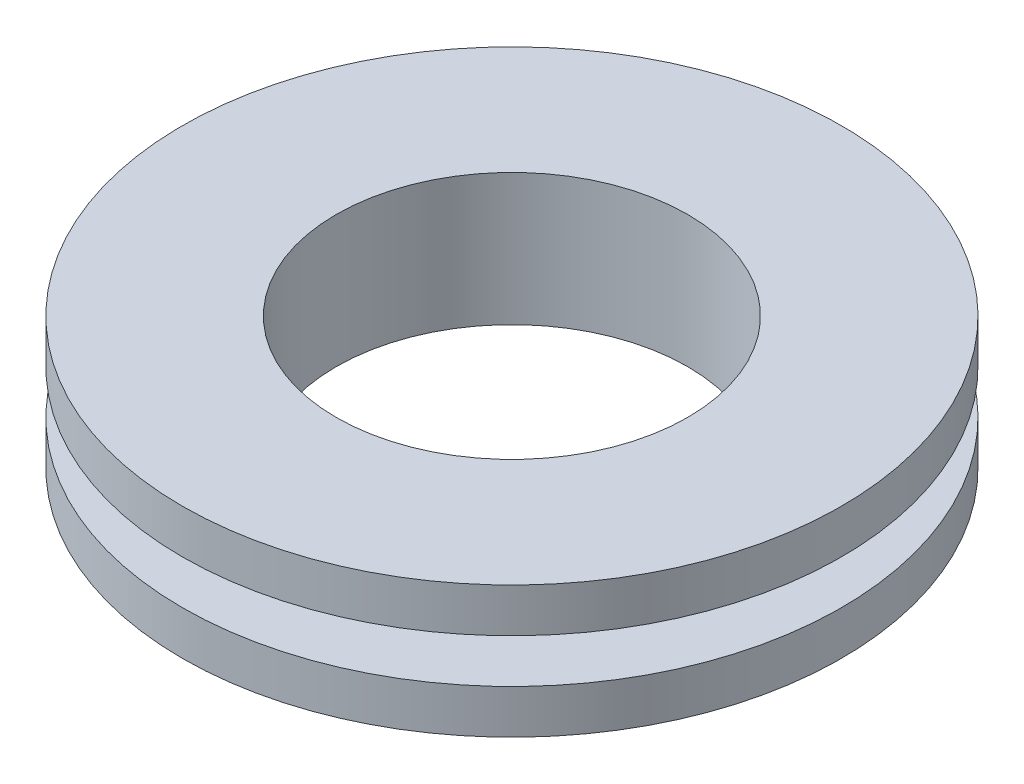
ISO-10303-21;
HEADER;
FILE_DESCRIPTION(('STEP AP214'),'2;1');
FILE_NAME('part.step','',(''),(''),'','','');
FILE_SCHEMA(('AUTOMOTIVE_DESIGN { 1 0 10303 214 1 1 1 1 }'));
ENDSEC;
DATA;
#1=APPLICATION_CONTEXT('core data for automotive mechanical design processes');
#2=APPLICATION_PROTOCOL_DEFINITION('international standard','automotive_design',2000,#1);
#3=PRODUCT_CONTEXT('',#1,'mechanical');
#4=PRODUCT('Part','Part','',(#3));
#5=PRODUCT_RELATED_PRODUCT_CATEGORY('part','',(#4));
#6=PRODUCT_DEFINITION_FORMATION('','',#4);
#7=PRODUCT_DEFINITION_CONTEXT('part definition',#1,'design');
#8=PRODUCT_DEFINITION('design','',#6,#7);
#9=PRODUCT_DEFINITION_SHAPE('','',#8);
#10=(LENGTH_UNIT() NAMED_UNIT(*) SI_UNIT(.MILLI.,.METRE.));
#11=(NAMED_UNIT(*) PLANE_ANGLE_UNIT() SI_UNIT($,.RADIAN.));
#12=(NAMED_UNIT(*) SI_UNIT($,.STERADIAN.) SOLID_ANGLE_UNIT());
#13=UNCERTAINTY_MEASURE_WITH_UNIT(LENGTH_MEASURE(1.E-05),#10,'distance_accuracy_value','');
#14=(GEOMETRIC_REPRESENTATION_CONTEXT(3) GLOBAL_UNCERTAINTY_ASSIGNED_CONTEXT((#13)) GLOBAL_UNIT_ASSIGNED_CONTEXT((#10,
#11,#12)) REPRESENTATION_CONTEXT('',''));
#15=CARTESIAN_POINT('',(0.,0.,0.));
#16=DIRECTION('',(0.,0.,1.));
#17=DIRECTION('',(1.,0.,0.));
#18=AXIS2_PLACEMENT_3D('',#15,#16,#17);
#19=CARTESIAN_POINT('',(4.,1.5,0.));
#20=DIRECTION('',(0.,-1.,0.));
#21=DIRECTION('',(0.,0.,-1.));
#22=AXIS2_PLACEMENT_3D('',#19,#20,#21);
#23=PLANE('',#22);
#24=CARTESIAN_POINT('',(0.,1.5,0.));
#25=DIRECTION('',(0.,1.,0.));
#26=DIRECTION('',(0.,0.,1.));
#27=AXIS2_PLACEMENT_3D('',#24,#25,#26);
#28=CIRCLE('',#27,4.);
#29=CARTESIAN_POINT('',(0.,1.5,4.));
#30=VERTEX_POINT('',#29);
#31=EDGE_CURVE('E67',#30,#30,#28,.T.);
#32=ORIENTED_EDGE('',*,*,#31,.F.);
#33=EDGE_LOOP('',(#32));
#34=FACE_BOUND('',#33,.T.);
#35=CARTESIAN_POINT('',(0.,1.5,0.));
#36=DIRECTION('',(0.,1.,0.));
#37=DIRECTION('',(0.,0.,1.));
#38=AXIS2_PLACEMENT_3D('',#35,#36,#37);
#39=CIRCLE('',#38,7.5);
#40=CARTESIAN_POINT('',(0.,1.5,7.5));
#41=VERTEX_POINT('',#40);
#42=EDGE_CURVE('E10',#41,#41,#39,.T.);
#43=ORIENTED_EDGE('',*,*,#42,.T.);
#44=EDGE_LOOP('',(#43));
#45=FACE_BOUND('',#44,.T.);
#46=ADVANCED_FACE('F39',(#34,#45),#23,.F.);
#47=CARTESIAN_POINT('',(0.,5.87055879509432,0.));
#48=DIRECTION('',(0.,1.,0.));
#49=DIRECTION('',(0.,0.,1.));
#50=AXIS2_PLACEMENT_3D('',#47,#48,#49);
#51=CYLINDRICAL_SURFACE('',#50,7.5);
#52=ORIENTED_EDGE('',*,*,#42,.F.);
#53=EDGE_LOOP('',(#52));
#54=FACE_BOUND('',#53,.T.);
#55=CARTESIAN_POINT('',(0.,0.5,0.));
#56=DIRECTION('',(0.,1.,0.));
#57=DIRECTION('',(0.,0.,1.));
#58=AXIS2_PLACEMENT_3D('',#55,#56,#57);
#59=CIRCLE('',#58,7.5);
#60=CARTESIAN_POINT('',(0.,0.5,7.5));
#61=VERTEX_POINT('',#60);
#62=EDGE_CURVE('E45',#61,#61,#59,.T.);
#63=ORIENTED_EDGE('',*,*,#62,.T.);
#64=EDGE_LOOP('',(#63));
#65=FACE_BOUND('',#64,.T.);
#66=ADVANCED_FACE('F74',(#54,#65),#51,.T.);
#67=CARTESIAN_POINT('',(7.5,0.5,0.));
#68=DIRECTION('',(0.,1.,0.));
#69=DIRECTION('',(0.,0.,1.));
#70=AXIS2_PLACEMENT_3D('',#67,#68,#69);
#71=PLANE('',#70);
#72=ORIENTED_EDGE('',*,*,#62,.F.);
#73=EDGE_LOOP('',(#72));
#74=FACE_BOUND('',#73,.T.);
#75=CARTESIAN_POINT('',(0.,0.5,0.));
#76=DIRECTION('',(0.,1.,0.));
#77=DIRECTION('',(0.,0.,1.));
#78=AXIS2_PLACEMENT_3D('',#75,#76,#77);
#79=CIRCLE('',#78,6.);
#80=CARTESIAN_POINT('',(0.,0.5,6.));
#81=VERTEX_POINT('',#80);
#82=EDGE_CURVE('E49',#81,#81,#79,.T.);
#83=ORIENTED_EDGE('',*,*,#82,.T.);
#84=EDGE_LOOP('',(#83));
#85=FACE_BOUND('',#84,.T.);
#86=ADVANCED_FACE('F78',(#74,#85),#71,.F.);
#87=CARTESIAN_POINT('',(0.,5.87055879509432,0.));
#88=DIRECTION('',(0.,1.,0.));
#89=DIRECTION('',(0.,0.,1.));
#90=AXIS2_PLACEMENT_3D('',#87,#88,#89);
#91=CYLINDRICAL_SURFACE('',#90,6.);
#92=ORIENTED_EDGE('',*,*,#82,.F.);
#93=EDGE_LOOP('',(#92));
#94=FACE_BOUND('',#93,.T.);
#95=CARTESIAN_POINT('',(0.,-0.5,0.));
#96=DIRECTION('',(0.,1.,0.));
#97=DIRECTION('',(0.,0.,1.));
#98=AXIS2_PLACEMENT_3D('',#95,#96,#97);
#99=CIRCLE('',#98,6.);
#100=CARTESIAN_POINT('',(0.,-0.5,6.));
#101=VERTEX_POINT('',#100);
#102=EDGE_CURVE('E53',#101,#101,#99,.T.);
#103=ORIENTED_EDGE('',*,*,#102,.T.);
#104=EDGE_LOOP('',(#103));
#105=FACE_BOUND('',#104,.T.);
#106=ADVANCED_FACE('F83',(#94,#105),#91,.T.);
#107=CARTESIAN_POINT('',(6.,-0.5,0.));
#108=DIRECTION('',(0.,-1.,0.));
#109=DIRECTION('',(0.,0.,-1.));
#110=AXIS2_PLACEMENT_3D('',#107,#108,#109);
#111=PLANE('',#110);
#112=ORIENTED_EDGE('',*,*,#102,.F.);
#113=EDGE_LOOP('',(#112));
#114=FACE_BOUND('',#113,.T.);
#115=CARTESIAN_POINT('',(0.,-0.5,0.));
#116=DIRECTION('',(0.,1.,0.));
#117=DIRECTION('',(0.,0.,1.));
#118=AXIS2_PLACEMENT_3D('',#115,#116,#117);
#119=CIRCLE('',#118,7.5);
#120=CARTESIAN_POINT('',(0.,-0.5,7.5));
#121=VERTEX_POINT('',#120);
#122=EDGE_CURVE('E58',#121,#121,#119,.T.);
#123=ORIENTED_EDGE('',*,*,#122,.T.);
#124=EDGE_LOOP('',(#123));
#125=FACE_BOUND('',#124,.T.);
#126=ADVANCED_FACE('F89',(#114,#125),#111,.F.);
#127=CARTESIAN_POINT('',(0.,5.87055879509432,0.));
#128=DIRECTION('',(0.,1.,0.));
#129=DIRECTION('',(0.,0.,1.));
#130=AXIS2_PLACEMENT_3D('',#127,#128,#129);
#131=CYLINDRICAL_SURFACE('',#130,7.5);
#132=ORIENTED_EDGE('',*,*,#122,.F.);
#133=EDGE_LOOP('',(#132));
#134=FACE_BOUND('',#133,.T.);
#135=CARTESIAN_POINT('',(0.,-1.5,0.));
#136=DIRECTION('',(0.,1.,0.));
#137=DIRECTION('',(0.,0.,1.));
#138=AXIS2_PLACEMENT_3D('',#135,#136,#137);
#139=CIRCLE('',#138,7.5);
#140=CARTESIAN_POINT('',(0.,-1.5,7.5));
#141=VERTEX_POINT('',#140);
#142=EDGE_CURVE('E61',#141,#141,#139,.T.);
#143=ORIENTED_EDGE('',*,*,#142,.T.);
#144=EDGE_LOOP('',(#143));
#145=FACE_BOUND('',#144,.T.);
#146=ADVANCED_FACE('F93',(#134,#145),#131,.T.);
#147=CARTESIAN_POINT('',(7.5,-1.5,0.));
#148=DIRECTION('',(0.,1.,0.));
#149=DIRECTION('',(0.,0.,1.));
#150=AXIS2_PLACEMENT_3D('',#147,#148,#149);
#151=PLANE('',#150);
#152=ORIENTED_EDGE('',*,*,#142,.F.);
#153=EDGE_LOOP('',(#152));
#154=FACE_BOUND('',#153,.T.);
#155=CARTESIAN_POINT('',(0.,-1.5,0.));
#156=DIRECTION('',(0.,1.,0.));
#157=DIRECTION('',(0.,0.,1.));
#158=AXIS2_PLACEMENT_3D('',#155,#156,#157);
#159=CIRCLE('',#158,4.);
#160=CARTESIAN_POINT('',(0.,-1.5,4.));
#161=VERTEX_POINT('',#160);
#162=EDGE_CURVE('E64',#161,#161,#159,.T.);
#163=ORIENTED_EDGE('',*,*,#162,.T.);
#164=EDGE_LOOP('',(#163));
#165=FACE_BOUND('',#164,.T.);
#166=ADVANCED_FACE('F97',(#154,#165),#151,.F.);
#167=CARTESIAN_POINT('',(0.,5.87055879509432,0.));
#168=DIRECTION('',(0.,1.,0.));
#169=DIRECTION('',(0.,0.,1.));
#170=AXIS2_PLACEMENT_3D('',#167,#168,#169);
#171=CYLINDRICAL_SURFACE('',#170,4.);
#172=ORIENTED_EDGE('',*,*,#162,.F.);
#173=EDGE_LOOP('',(#172));
#174=FACE_BOUND('',#173,.T.);
#175=ORIENTED_EDGE('',*,*,#31,.T.);
#176=EDGE_LOOP('',(#175));
#177=FACE_BOUND('',#176,.T.);
#178=ADVANCED_FACE('F71',(#174,#177),#171,.F.);
#179=CLOSED_SHELL('',(#46,#66,#86,#106,#126,#146,#166,#178));
#180=MANIFOLD_SOLID_BREP('B2',#179);
#181=ADVANCED_BREP_SHAPE_REPRESENTATION('',(#18,#180),#14);
#182=SHAPE_DEFINITION_REPRESENTATION(#9,#181);
ENDSEC;
END-ISO-10303-21;
